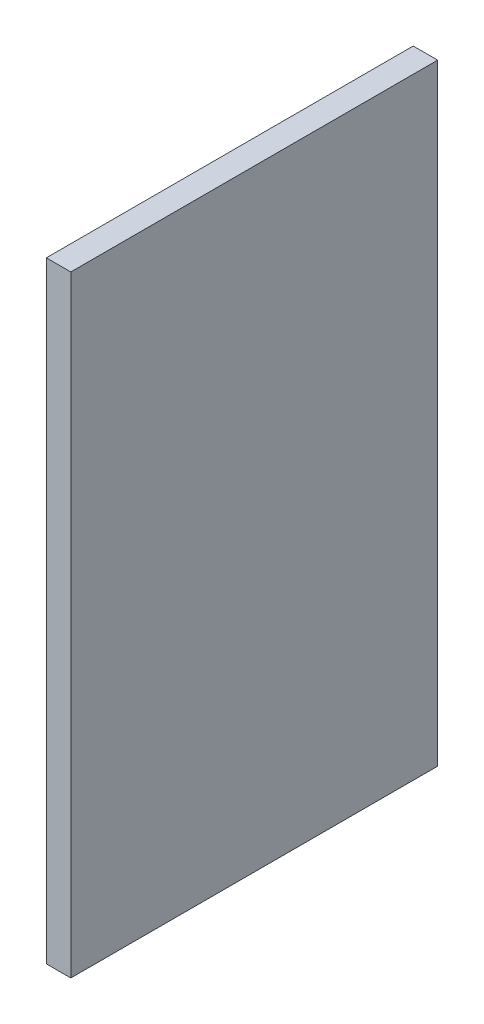
ISO-10303-21;
HEADER;
FILE_DESCRIPTION(('STEP AP214'),'2;1');
FILE_NAME('part.step','',(''),(''),'','','');
FILE_SCHEMA(('AUTOMOTIVE_DESIGN { 1 0 10303 214 1 1 1 1 }'));
ENDSEC;
DATA;
#1=APPLICATION_CONTEXT('core data for automotive mechanical design processes');
#2=APPLICATION_PROTOCOL_DEFINITION('international standard','automotive_design',2000,#1);
#3=PRODUCT_CONTEXT('',#1,'mechanical');
#4=PRODUCT('Part','Part','',(#3));
#5=PRODUCT_RELATED_PRODUCT_CATEGORY('part','',(#4));
#6=PRODUCT_DEFINITION_FORMATION('','',#4);
#7=PRODUCT_DEFINITION_CONTEXT('part definition',#1,'design');
#8=PRODUCT_DEFINITION('design','',#6,#7);
#9=PRODUCT_DEFINITION_SHAPE('','',#8);
#10=(LENGTH_UNIT() NAMED_UNIT(*) SI_UNIT(.MILLI.,.METRE.));
#11=(NAMED_UNIT(*) PLANE_ANGLE_UNIT() SI_UNIT($,.RADIAN.));
#12=(NAMED_UNIT(*) SI_UNIT($,.STERADIAN.) SOLID_ANGLE_UNIT());
#13=UNCERTAINTY_MEASURE_WITH_UNIT(LENGTH_MEASURE(1.E-05),#10,'distance_accuracy_value','');
#14=(GEOMETRIC_REPRESENTATION_CONTEXT(3) GLOBAL_UNCERTAINTY_ASSIGNED_CONTEXT((#13)) GLOBAL_UNIT_ASSIGNED_CONTEXT((#10,
#11,#12)) REPRESENTATION_CONTEXT('',''));
#15=CARTESIAN_POINT('',(0.,0.,0.));
#16=DIRECTION('',(0.,0.,1.));
#17=DIRECTION('',(1.,0.,0.));
#18=AXIS2_PLACEMENT_3D('',#15,#16,#17);
#19=CARTESIAN_POINT('',(-110.,-10.,38.));
#20=DIRECTION('',(-1.,0.,0.));
#21=DIRECTION('',(0.,0.,1.));
#22=AXIS2_PLACEMENT_3D('',#19,#20,#21);
#23=PLANE('',#22);
#24=DIRECTION('',(0.,1.,0.));
#25=VECTOR('',#24,1.);
#26=CARTESIAN_POINT('',(-110.,-10.,38.));
#27=LINE('',#26,#25);
#28=CARTESIAN_POINT('',(-110.,-10.,38.));
#29=VERTEX_POINT('',#28);
#30=CARTESIAN_POINT('',(-110.,10.,38.));
#31=VERTEX_POINT('',#30);
#32=EDGE_CURVE('E40',#29,#31,#27,.T.);
#33=ORIENTED_EDGE('',*,*,#32,.T.);
#34=DIRECTION('',(0.,0.,1.));
#35=VECTOR('',#34,1.);
#36=CARTESIAN_POINT('',(-110.,10.,38.));
#37=LINE('',#36,#35);
#38=CARTESIAN_POINT('',(-110.,10.,26.));
#39=VERTEX_POINT('',#38);
#40=EDGE_CURVE('E77',#39,#31,#37,.T.);
#41=ORIENTED_EDGE('',*,*,#40,.F.);
#42=DIRECTION('',(0.,1.,0.));
#43=VECTOR('',#42,1.);
#44=CARTESIAN_POINT('',(-110.,-10.,26.));
#45=LINE('',#44,#43);
#46=CARTESIAN_POINT('',(-110.,-10.,26.));
#47=VERTEX_POINT('',#46);
#48=EDGE_CURVE('E11',#47,#39,#45,.T.);
#49=ORIENTED_EDGE('',*,*,#48,.F.);
#50=DIRECTION('',(0.,0.,1.));
#51=VECTOR('',#50,1.);
#52=CARTESIAN_POINT('',(-110.,-10.,38.));
#53=LINE('',#52,#51);
#54=EDGE_CURVE('E78',#47,#29,#53,.T.);
#55=ORIENTED_EDGE('',*,*,#54,.T.);
#56=EDGE_LOOP('',(#33,#41,#49,#55));
#57=FACE_BOUND('',#56,.T.);
#58=ADVANCED_FACE('F37',(#57),#23,.T.);
#59=CARTESIAN_POINT('',(-110.,-10.,26.));
#60=DIRECTION('',(0.,0.,-1.));
#61=DIRECTION('',(-1.,0.,0.));
#62=AXIS2_PLACEMENT_3D('',#59,#60,#61);
#63=PLANE('',#62);
#64=ORIENTED_EDGE('',*,*,#48,.T.);
#65=DIRECTION('',(-1.,0.,0.));
#66=VECTOR('',#65,1.);
#67=CARTESIAN_POINT('',(-110.,10.,26.));
#68=LINE('',#67,#66);
#69=CARTESIAN_POINT('',(-109.2,10.,26.));
#70=VERTEX_POINT('',#69);
#71=EDGE_CURVE('E94',#70,#39,#68,.T.);
#72=ORIENTED_EDGE('',*,*,#71,.F.);
#73=DIRECTION('',(0.,1.,0.));
#74=VECTOR('',#73,1.);
#75=CARTESIAN_POINT('',(-109.2,-10.,26.));
#76=LINE('',#75,#74);
#77=CARTESIAN_POINT('',(-109.2,-10.,26.));
#78=VERTEX_POINT('',#77);
#79=EDGE_CURVE('E45',#78,#70,#76,.T.);
#80=ORIENTED_EDGE('',*,*,#79,.F.);
#81=DIRECTION('',(-1.,0.,0.));
#82=VECTOR('',#81,1.);
#83=CARTESIAN_POINT('',(-110.,-10.,26.));
#84=LINE('',#83,#82);
#85=EDGE_CURVE('E83',#78,#47,#84,.T.);
#86=ORIENTED_EDGE('',*,*,#85,.T.);
#87=EDGE_LOOP('',(#64,#72,#80,#86));
#88=FACE_BOUND('',#87,.T.);
#89=ADVANCED_FACE('F109',(#88),#63,.T.);
#90=CARTESIAN_POINT('',(-109.2,-10.,38.));
#91=DIRECTION('',(1.,0.,0.));
#92=DIRECTION('',(0.,0.,-1.));
#93=AXIS2_PLACEMENT_3D('',#90,#91,#92);
#94=PLANE('',#93);
#95=ORIENTED_EDGE('',*,*,#79,.T.);
#96=DIRECTION('',(0.,0.,-1.));
#97=VECTOR('',#96,1.);
#98=CARTESIAN_POINT('',(-109.2,10.,38.));
#99=LINE('',#98,#97);
#100=CARTESIAN_POINT('',(-109.2,10.,38.));
#101=VERTEX_POINT('',#100);
#102=EDGE_CURVE('E90',#101,#70,#99,.T.);
#103=ORIENTED_EDGE('',*,*,#102,.F.);
#104=DIRECTION('',(0.,1.,0.));
#105=VECTOR('',#104,1.);
#106=CARTESIAN_POINT('',(-109.2,-10.,38.));
#107=LINE('',#106,#105);
#108=CARTESIAN_POINT('',(-109.2,-10.,38.));
#109=VERTEX_POINT('',#108);
#110=EDGE_CURVE('E82',#109,#101,#107,.T.);
#111=ORIENTED_EDGE('',*,*,#110,.F.);
#112=DIRECTION('',(0.,0.,-1.));
#113=VECTOR('',#112,1.);
#114=CARTESIAN_POINT('',(-109.2,-10.,38.));
#115=LINE('',#114,#113);
#116=EDGE_CURVE('E102',#109,#78,#115,.T.);
#117=ORIENTED_EDGE('',*,*,#116,.T.);
#118=EDGE_LOOP('',(#95,#103,#111,#117));
#119=FACE_BOUND('',#118,.T.);
#120=ADVANCED_FACE('F106',(#119),#94,.T.);
#121=CARTESIAN_POINT('',(-110.,-10.,38.));
#122=DIRECTION('',(0.,0.,1.));
#123=DIRECTION('',(1.,0.,0.));
#124=AXIS2_PLACEMENT_3D('',#121,#122,#123);
#125=PLANE('',#124);
#126=ORIENTED_EDGE('',*,*,#110,.T.);
#127=DIRECTION('',(1.,0.,0.));
#128=VECTOR('',#127,1.);
#129=CARTESIAN_POINT('',(-110.,10.,38.));
#130=LINE('',#129,#128);
#131=EDGE_CURVE('E85',#31,#101,#130,.T.);
#132=ORIENTED_EDGE('',*,*,#131,.F.);
#133=ORIENTED_EDGE('',*,*,#32,.F.);
#134=DIRECTION('',(1.,0.,0.));
#135=VECTOR('',#134,1.);
#136=CARTESIAN_POINT('',(-110.,-10.,38.));
#137=LINE('',#136,#135);
#138=EDGE_CURVE('E100',#29,#109,#137,.T.);
#139=ORIENTED_EDGE('',*,*,#138,.T.);
#140=EDGE_LOOP('',(#126,#132,#133,#139));
#141=FACE_BOUND('',#140,.T.);
#142=ADVANCED_FACE('F86',(#141),#125,.T.);
#143=CARTESIAN_POINT('',(0.,-10.,0.));
#144=DIRECTION('',(0.,-1.,0.));
#145=DIRECTION('',(0.,0.,-1.));
#146=AXIS2_PLACEMENT_3D('',#143,#144,#145);
#147=PLANE('',#146);
#148=ORIENTED_EDGE('',*,*,#54,.F.);
#149=ORIENTED_EDGE('',*,*,#85,.F.);
#150=ORIENTED_EDGE('',*,*,#116,.F.);
#151=ORIENTED_EDGE('',*,*,#138,.F.);
#152=EDGE_LOOP('',(#148,#149,#150,#151));
#153=FACE_BOUND('',#152,.T.);
#154=ADVANCED_FACE('F111',(#153),#147,.T.);
#155=CARTESIAN_POINT('',(0.,10.,0.));
#156=DIRECTION('',(0.,-1.,0.));
#157=DIRECTION('',(0.,0.,-1.));
#158=AXIS2_PLACEMENT_3D('',#155,#156,#157);
#159=PLANE('',#158);
#160=ORIENTED_EDGE('',*,*,#40,.T.);
#161=ORIENTED_EDGE('',*,*,#131,.T.);
#162=ORIENTED_EDGE('',*,*,#102,.T.);
#163=ORIENTED_EDGE('',*,*,#71,.T.);
#164=EDGE_LOOP('',(#160,#161,#162,#163));
#165=FACE_BOUND('',#164,.T.);
#166=ADVANCED_FACE('F93',(#165),#159,.F.);
#167=CLOSED_SHELL('',(#58,#89,#120,#142,#154,#166));
#168=MANIFOLD_SOLID_BREP('B2',#167);
#169=ADVANCED_BREP_SHAPE_REPRESENTATION('',(#18,#168),#14);
#170=SHAPE_DEFINITION_REPRESENTATION(#9,#169);
ENDSEC;
END-ISO-10303-21;
